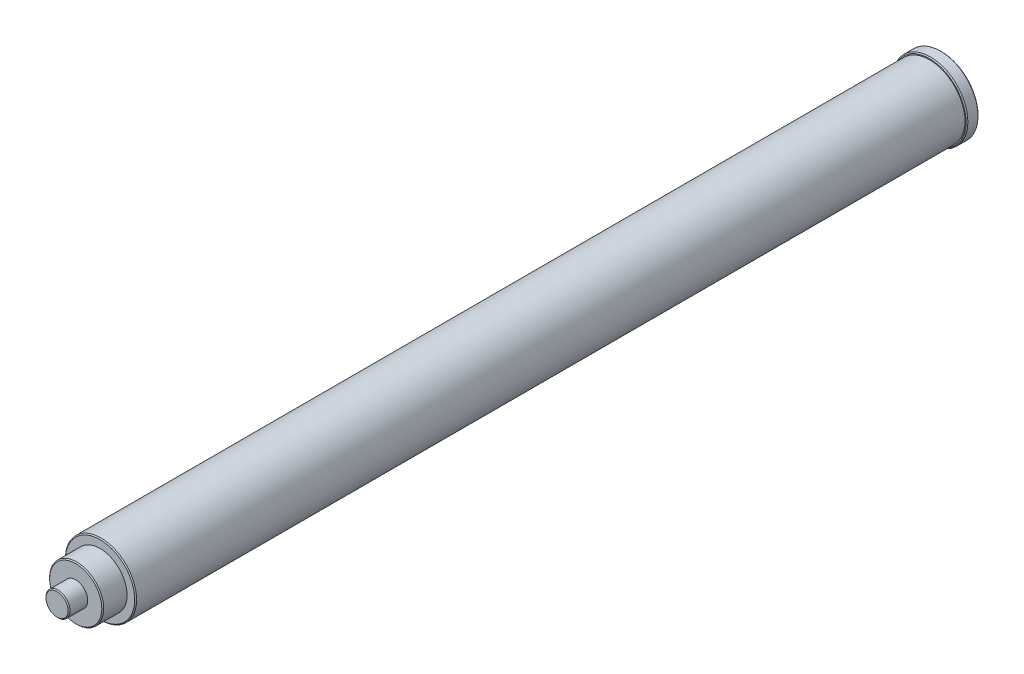
ISO-10303-21;
HEADER;
FILE_DESCRIPTION(('STEP AP214'),'2;1');
FILE_NAME('part.step','',(''),(''),'','','');
FILE_SCHEMA(('AUTOMOTIVE_DESIGN { 1 0 10303 214 1 1 1 1 }'));
ENDSEC;
DATA;
#1=APPLICATION_CONTEXT('core data for automotive mechanical design processes');
#2=APPLICATION_PROTOCOL_DEFINITION('international standard','automotive_design',2000,#1);
#3=PRODUCT_CONTEXT('',#1,'mechanical');
#4=PRODUCT('Part','Part','',(#3));
#5=PRODUCT_RELATED_PRODUCT_CATEGORY('part','',(#4));
#6=PRODUCT_DEFINITION_FORMATION('','',#4);
#7=PRODUCT_DEFINITION_CONTEXT('part definition',#1,'design');
#8=PRODUCT_DEFINITION('design','',#6,#7);
#9=PRODUCT_DEFINITION_SHAPE('','',#8);
#10=(LENGTH_UNIT() NAMED_UNIT(*) SI_UNIT(.MILLI.,.METRE.));
#11=(NAMED_UNIT(*) PLANE_ANGLE_UNIT() SI_UNIT($,.RADIAN.));
#12=(NAMED_UNIT(*) SI_UNIT($,.STERADIAN.) SOLID_ANGLE_UNIT());
#13=UNCERTAINTY_MEASURE_WITH_UNIT(LENGTH_MEASURE(1.E-05),#10,'distance_accuracy_value','');
#14=(GEOMETRIC_REPRESENTATION_CONTEXT(3) GLOBAL_UNCERTAINTY_ASSIGNED_CONTEXT((#13)) GLOBAL_UNIT_ASSIGNED_CONTEXT((#10,
#11,#12)) REPRESENTATION_CONTEXT('',''));
#15=CARTESIAN_POINT('',(0.,0.,0.));
#16=DIRECTION('',(0.,0.,1.));
#17=DIRECTION('',(1.,0.,0.));
#18=AXIS2_PLACEMENT_3D('',#15,#16,#17);
#19=CARTESIAN_POINT('',(0.,0.,12.7));
#20=DIRECTION('',(0.,0.,-1.));
#21=DIRECTION('',(-1.,0.,0.));
#22=AXIS2_PLACEMENT_3D('',#19,#20,#21);
#23=CYLINDRICAL_SURFACE('',#22,39.6875);
#24=CARTESIAN_POINT('',(0.,0.,0.999999999999987));
#25=DIRECTION('',(0.,0.,1.));
#26=DIRECTION('',(1.,0.,0.));
#27=AXIS2_PLACEMENT_3D('',#24,#25,#26);
#28=CIRCLE('',#27,39.6875);
#29=CARTESIAN_POINT('',(39.6875,0.,0.999999999999987));
#30=VERTEX_POINT('',#29);
#31=EDGE_CURVE('E76',#30,#30,#28,.T.);
#32=ORIENTED_EDGE('',*,*,#31,.T.);
#33=EDGE_LOOP('',(#32));
#34=FACE_BOUND('',#33,.T.);
#35=CARTESIAN_POINT('',(0.,0.,11.7));
#36=DIRECTION('',(0.,0.,1.));
#37=DIRECTION('',(1.,0.,0.));
#38=AXIS2_PLACEMENT_3D('',#35,#36,#37);
#39=CIRCLE('',#38,39.6875);
#40=CARTESIAN_POINT('',(39.6875,0.,11.7));
#41=VERTEX_POINT('',#40);
#42=EDGE_CURVE('E79',#41,#41,#39,.F.);
#43=ORIENTED_EDGE('',*,*,#42,.T.);
#44=EDGE_LOOP('',(#43));
#45=FACE_BOUND('',#44,.T.);
#46=ADVANCED_FACE('F43',(#34,#45),#23,.T.);
#47=CARTESIAN_POINT('',(0.,0.,12.7));
#48=DIRECTION('',(0.,0.,1.));
#49=DIRECTION('',(1.,0.,0.));
#50=AXIS2_PLACEMENT_3D('',#47,#48,#49);
#51=PLANE('',#50);
#52=CARTESIAN_POINT('',(0.,0.,12.7));
#53=DIRECTION('',(0.,0.,1.));
#54=DIRECTION('',(1.,0.,0.));
#55=AXIS2_PLACEMENT_3D('',#52,#53,#54);
#56=CIRCLE('',#55,38.6875);
#57=CARTESIAN_POINT('',(38.6875,0.,12.7));
#58=VERTEX_POINT('',#57);
#59=EDGE_CURVE('E70',#58,#58,#56,.T.);
#60=ORIENTED_EDGE('',*,*,#59,.T.);
#61=EDGE_LOOP('',(#60));
#62=FACE_BOUND('',#61,.T.);
#63=CARTESIAN_POINT('',(0.,0.,12.7));
#64=DIRECTION('',(0.,0.,1.));
#65=DIRECTION('',(1.,0.,0.));
#66=AXIS2_PLACEMENT_3D('',#63,#64,#65);
#67=CIRCLE('',#66,37.6555);
#68=CARTESIAN_POINT('',(37.6555,0.,12.7));
#69=VERTEX_POINT('',#68);
#70=EDGE_CURVE('E83',#69,#69,#67,.T.);
#71=ORIENTED_EDGE('',*,*,#70,.F.);
#72=EDGE_LOOP('',(#71));
#73=FACE_BOUND('',#72,.T.);
#74=ADVANCED_FACE('F110',(#62,#73),#51,.T.);
#75=CARTESIAN_POINT('',(0.,0.,0.));
#76=DIRECTION('',(0.,0.,1.));
#77=DIRECTION('',(1.,0.,0.));
#78=AXIS2_PLACEMENT_3D('',#75,#76,#77);
#79=PLANE('',#78);
#80=CARTESIAN_POINT('',(0.,0.,0.));
#81=DIRECTION('',(0.,0.,1.));
#82=DIRECTION('',(1.,0.,0.));
#83=AXIS2_PLACEMENT_3D('',#80,#81,#82);
#84=CIRCLE('',#83,38.6874999999999);
#85=CARTESIAN_POINT('',(38.6874999999999,0.,0.));
#86=VERTEX_POINT('',#85);
#87=EDGE_CURVE('E73',#86,#86,#84,.F.);
#88=ORIENTED_EDGE('',*,*,#87,.T.);
#89=EDGE_LOOP('',(#88));
#90=FACE_BOUND('',#89,.T.);
#91=ADVANCED_FACE('F116',(#90),#79,.F.);
#92=CARTESIAN_POINT('',(0.,0.,889.9906));
#93=DIRECTION('',(0.,0.,-1.));
#94=DIRECTION('',(-1.,0.,0.));
#95=AXIS2_PLACEMENT_3D('',#92,#93,#94);
#96=CYLINDRICAL_SURFACE('',#95,37.6555);
#97=CARTESIAN_POINT('',(0.,0.,888.9906));
#98=DIRECTION('',(0.,0.,1.));
#99=DIRECTION('',(1.,0.,0.));
#100=AXIS2_PLACEMENT_3D('',#97,#98,#99);
#101=CIRCLE('',#100,37.6555);
#102=CARTESIAN_POINT('',(37.6555,0.,888.9906));
#103=VERTEX_POINT('',#102);
#104=EDGE_CURVE('E64',#103,#103,#101,.F.);
#105=ORIENTED_EDGE('',*,*,#104,.T.);
#106=EDGE_LOOP('',(#105));
#107=FACE_BOUND('',#106,.T.);
#108=ORIENTED_EDGE('',*,*,#70,.T.);
#109=EDGE_LOOP('',(#108));
#110=FACE_BOUND('',#109,.T.);
#111=ADVANCED_FACE('F159',(#107,#110),#96,.T.);
#112=CARTESIAN_POINT('',(0.,0.,889.9906));
#113=DIRECTION('',(0.,0.,1.));
#114=DIRECTION('',(1.,0.,0.));
#115=AXIS2_PLACEMENT_3D('',#112,#113,#114);
#116=PLANE('',#115);
#117=CARTESIAN_POINT('',(0.,0.,889.9906));
#118=DIRECTION('',(0.,0.,1.));
#119=DIRECTION('',(1.,0.,0.));
#120=AXIS2_PLACEMENT_3D('',#117,#118,#119);
#121=CIRCLE('',#120,36.6555);
#122=CARTESIAN_POINT('',(36.6555,0.,889.9906));
#123=VERTEX_POINT('',#122);
#124=EDGE_CURVE('E67',#123,#123,#121,.T.);
#125=ORIENTED_EDGE('',*,*,#124,.T.);
#126=EDGE_LOOP('',(#125));
#127=FACE_BOUND('',#126,.T.);
#128=CARTESIAN_POINT('',(0.,0.,889.9906));
#129=DIRECTION('',(0.,0.,1.));
#130=DIRECTION('',(1.,0.,0.));
#131=AXIS2_PLACEMENT_3D('',#128,#129,#130);
#132=CIRCLE('',#131,28.575);
#133=CARTESIAN_POINT('',(28.575,0.,889.9906));
#134=VERTEX_POINT('',#133);
#135=EDGE_CURVE('E86',#134,#134,#132,.T.);
#136=ORIENTED_EDGE('',*,*,#135,.F.);
#137=EDGE_LOOP('',(#136));
#138=FACE_BOUND('',#137,.T.);
#139=ADVANCED_FACE('F105',(#127,#138),#116,.T.);
#140=CARTESIAN_POINT('',(0.,0.,1899.51310508962));
#141=DIRECTION('',(0.,0.,-1.));
#142=DIRECTION('',(-1.,0.,0.));
#143=AXIS2_PLACEMENT_3D('',#140,#141,#142);
#144=CYLINDRICAL_SURFACE('',#143,28.575);
#145=CARTESIAN_POINT('',(0.,0.,914.6954));
#146=DIRECTION('',(0.,0.,1.));
#147=DIRECTION('',(1.,0.,0.));
#148=AXIS2_PLACEMENT_3D('',#145,#146,#147);
#149=CIRCLE('',#148,28.575);
#150=CARTESIAN_POINT('',(28.575,0.,914.6954));
#151=VERTEX_POINT('',#150);
#152=EDGE_CURVE('E55',#151,#151,#149,.F.);
#153=ORIENTED_EDGE('',*,*,#152,.T.);
#154=EDGE_LOOP('',(#153));
#155=FACE_BOUND('',#154,.T.);
#156=ORIENTED_EDGE('',*,*,#135,.T.);
#157=EDGE_LOOP('',(#156));
#158=FACE_BOUND('',#157,.T.);
#159=ADVANCED_FACE('F96',(#155,#158),#144,.T.);
#160=CARTESIAN_POINT('',(0.,0.,915.6954));
#161=DIRECTION('',(0.,0.,1.));
#162=DIRECTION('',(1.,0.,0.));
#163=AXIS2_PLACEMENT_3D('',#160,#161,#162);
#164=PLANE('',#163);
#165=CARTESIAN_POINT('',(0.,0.,915.6954));
#166=DIRECTION('',(0.,0.,1.));
#167=DIRECTION('',(1.,0.,0.));
#168=AXIS2_PLACEMENT_3D('',#165,#166,#167);
#169=CIRCLE('',#168,27.5750000000001);
#170=CARTESIAN_POINT('',(27.5750000000001,0.,915.6954));
#171=VERTEX_POINT('',#170);
#172=EDGE_CURVE('E59',#171,#171,#169,.T.);
#173=ORIENTED_EDGE('',*,*,#172,.T.);
#174=EDGE_LOOP('',(#173));
#175=FACE_BOUND('',#174,.T.);
#176=CARTESIAN_POINT('',(0.,0.,915.6954));
#177=DIRECTION('',(0.,0.,1.));
#178=DIRECTION('',(1.,0.,0.));
#179=AXIS2_PLACEMENT_3D('',#176,#177,#178);
#180=CIRCLE('',#179,12.7);
#181=CARTESIAN_POINT('',(-12.7,0.,915.6954));
#182=VERTEX_POINT('',#181);
#183=EDGE_CURVE('E82',#182,#182,#180,.T.);
#184=ORIENTED_EDGE('',*,*,#183,.F.);
#185=EDGE_LOOP('',(#184));
#186=FACE_BOUND('',#185,.T.);
#187=ADVANCED_FACE('F94',(#175,#186),#164,.T.);
#188=CARTESIAN_POINT('',(0.,0.,1894.08342448428));
#189=DIRECTION('',(0.,0.,-1.));
#190=DIRECTION('',(-1.,0.,0.));
#191=AXIS2_PLACEMENT_3D('',#188,#189,#190);
#192=CYLINDRICAL_SURFACE('',#191,12.7);
#193=CARTESIAN_POINT('',(0.,0.,934.431200000001));
#194=DIRECTION('',(0.,0.,1.));
#195=DIRECTION('',(1.,0.,0.));
#196=AXIS2_PLACEMENT_3D('',#193,#194,#195);
#197=CIRCLE('',#196,12.7);
#198=CARTESIAN_POINT('',(-12.7,0.,934.431200000001));
#199=VERTEX_POINT('',#198);
#200=EDGE_CURVE('E11',#199,#199,#197,.F.);
#201=CARTESIAN_POINT('',(-12.7,0.,934.431200000001));
#202=CARTESIAN_POINT('',(-12.7,0.,934.236035416668));
#203=CARTESIAN_POINT('',(-12.7,0.,934.040870833334));
#204=CARTESIAN_POINT('',(-12.7,0.,933.650541666668));
#205=CARTESIAN_POINT('',(-12.7,0.,933.455377083334));
#206=CARTESIAN_POINT('',(-12.7,0.,933.065047916667));
#207=CARTESIAN_POINT('',(-12.7,0.,932.869883333334));
#208=CARTESIAN_POINT('',(-12.7,0.,932.479554166668));
#209=CARTESIAN_POINT('',(-12.7,0.,932.284389583334));
#210=CARTESIAN_POINT('',(-12.7,0.,931.894060416667));
#211=CARTESIAN_POINT('',(-12.7,0.,931.698895833334));
#212=CARTESIAN_POINT('',(-12.7,0.,931.308566666667));
#213=CARTESIAN_POINT('',(-12.7,0.,931.113402083334));
#214=CARTESIAN_POINT('',(-12.7,0.,930.723072916667));
#215=CARTESIAN_POINT('',(-12.7,0.,930.527908333334));
#216=CARTESIAN_POINT('',(-12.7,0.,930.137579166667));
#217=CARTESIAN_POINT('',(-12.7,0.,929.942414583334));
#218=CARTESIAN_POINT('',(-12.7,0.,929.552085416667));
#219=CARTESIAN_POINT('',(-12.7,0.,929.356920833334));
#220=CARTESIAN_POINT('',(-12.7,0.,928.966591666667));
#221=CARTESIAN_POINT('',(-12.7,0.,928.771427083334));
#222=CARTESIAN_POINT('',(-12.7,0.,928.381097916667));
#223=CARTESIAN_POINT('',(-12.7,0.,928.185933333334));
#224=CARTESIAN_POINT('',(-12.7,0.,927.795604166667));
#225=CARTESIAN_POINT('',(-12.7,0.,927.600439583334));
#226=CARTESIAN_POINT('',(-12.7,0.,927.210110416667));
#227=CARTESIAN_POINT('',(-12.7,0.,927.014945833334));
#228=CARTESIAN_POINT('',(-12.7,0.,926.624616666667));
#229=CARTESIAN_POINT('',(-12.7,0.,926.429452083334));
#230=CARTESIAN_POINT('',(-12.7,0.,926.039122916667));
#231=CARTESIAN_POINT('',(-12.7,0.,925.843958333334));
#232=CARTESIAN_POINT('',(-12.7,0.,925.453629166667));
#233=CARTESIAN_POINT('',(-12.7,0.,925.258464583334));
#234=CARTESIAN_POINT('',(-12.7,0.,924.868135416667));
#235=CARTESIAN_POINT('',(-12.7,0.,924.672970833334));
#236=CARTESIAN_POINT('',(-12.7,0.,924.282641666667));
#237=CARTESIAN_POINT('',(-12.7,0.,924.087477083334));
#238=CARTESIAN_POINT('',(-12.7,0.,923.697147916667));
#239=CARTESIAN_POINT('',(-12.7,0.,923.501983333334));
#240=CARTESIAN_POINT('',(-12.7,0.,923.111654166667));
#241=CARTESIAN_POINT('',(-12.7,0.,922.916489583334));
#242=CARTESIAN_POINT('',(-12.7,0.,922.526160416667));
#243=CARTESIAN_POINT('',(-12.7,0.,922.330995833334));
#244=CARTESIAN_POINT('',(-12.7,0.,921.940666666667));
#245=CARTESIAN_POINT('',(-12.7,0.,921.745502083334));
#246=CARTESIAN_POINT('',(-12.7,0.,921.355172916667));
#247=CARTESIAN_POINT('',(-12.7,0.,921.160008333334));
#248=CARTESIAN_POINT('',(-12.7,0.,920.769679166667));
#249=CARTESIAN_POINT('',(-12.7,0.,920.574514583334));
#250=CARTESIAN_POINT('',(-12.7,0.,920.184185416667));
#251=CARTESIAN_POINT('',(-12.7,0.,919.989020833334));
#252=CARTESIAN_POINT('',(-12.7,0.,919.598691666667));
#253=CARTESIAN_POINT('',(-12.7,0.,919.403527083334));
#254=CARTESIAN_POINT('',(-12.7,0.,919.013197916667));
#255=CARTESIAN_POINT('',(-12.7,0.,918.818033333334));
#256=CARTESIAN_POINT('',(-12.7,0.,918.427704166667));
#257=CARTESIAN_POINT('',(-12.7,0.,918.232539583334));
#258=CARTESIAN_POINT('',(-12.7,0.,917.842210416667));
#259=CARTESIAN_POINT('',(-12.7,0.,917.647045833333));
#260=CARTESIAN_POINT('',(-12.7,0.,917.256716666667));
#261=CARTESIAN_POINT('',(-12.7,0.,917.061552083333));
#262=CARTESIAN_POINT('',(-12.7,0.,916.671222916667));
#263=CARTESIAN_POINT('',(-12.7,0.,916.476058333333));
#264=CARTESIAN_POINT('',(-12.7,0.,916.085729166667));
#265=CARTESIAN_POINT('',(-12.7,0.,915.890564583333));
#266=CARTESIAN_POINT('',(-12.7,0.,915.6954));
#267=B_SPLINE_CURVE_WITH_KNOTS('',3,(#201,#202,#203,#204,#205,#206,#207,#208,#209,#210,#211,
#212,#213,#214,#215,#216,#217,#218,#219,#220,#221,#222,#223,#224,#225,#226,#227,#228,#229,#230,
#231,#232,#233,#234,#235,#236,#237,#238,#239,#240,#241,#242,#243,#244,#245,#246,#247,#248,#249,
#250,#251,#252,#253,#254,#255,#256,#257,#258,#259,#260,#261,#262,#263,#264,#265,#266),
.UNSPECIFIED.,.F.,.F.,(4,2,2,2,2,2,2,2,2,2,2,2,2,2,2,2,2,2,2,2,2,2,2,2,2,2,2,2,2,2,2,2,4),(0.,
0.585493750000055,1.17098750000011,1.75648125000005,2.34197500000011,2.92746875000016,
3.51296250000011,4.09845625000016,4.68395000000021,5.26944375000027,5.85493750000032,
6.44043125000027,7.02592500000032,7.61141875000038,8.19691250000032,8.78240625000037,
9.36790000000043,9.95339375000048,10.5388875000005,11.1243812500005,11.7098750000005,
12.2953687500006,12.8808625000005,13.4663562500006,14.0518500000006,14.6373437500007,
15.2228375000008,15.8083312500007,16.3938250000007,16.9793187500008,17.5648125000007,
18.1503062500008,18.7358000000009),.UNSPECIFIED.);
#268=EDGE_CURVE('BSEAM92',#199,#182,#267,.T.);
#269=ORIENTED_EDGE('',*,*,#200,.T.);
#270=ORIENTED_EDGE('',*,*,#183,.T.);
#271=ORIENTED_EDGE('',*,*,#268,.T.);
#272=ORIENTED_EDGE('',*,*,#268,.F.);
#273=EDGE_LOOP('',(#269,#271,#270,#272));
#274=FACE_BOUND('',#273,.T.);
#275=ADVANCED_FACE('F92',(#274),#192,.T.);
#276=CARTESIAN_POINT('',(0.,0.,935.4312));
#277=DIRECTION('',(0.,0.,1.));
#278=DIRECTION('',(1.,0.,0.));
#279=AXIS2_PLACEMENT_3D('',#276,#277,#278);
#280=PLANE('',#279);
#281=CARTESIAN_POINT('',(0.,0.,935.4312));
#282=DIRECTION('',(0.,0.,1.));
#283=DIRECTION('',(1.,0.,0.));
#284=AXIS2_PLACEMENT_3D('',#281,#282,#283);
#285=CIRCLE('',#284,11.7000000000009);
#286=CARTESIAN_POINT('',(11.7000000000009,0.,935.4312));
#287=VERTEX_POINT('',#286);
#288=EDGE_CURVE('E51',#287,#287,#285,.T.);
#289=ORIENTED_EDGE('',*,*,#288,.T.);
#290=EDGE_LOOP('',(#289));
#291=FACE_BOUND('',#290,.T.);
#292=ADVANCED_FACE('F103',(#291),#280,.T.);
#293=CARTESIAN_POINT('',(0.,0.,0.999999999999987));
#294=DIRECTION('',(0.,0.,1.));
#295=DIRECTION('',(1.,0.,0.));
#296=AXIS2_PLACEMENT_3D('',#293,#294,#295);
#297=CONICAL_SURFACE('',#296,39.6875,0.785398163397518);
#298=ORIENTED_EDGE('',*,*,#87,.F.);
#299=EDGE_LOOP('',(#298));
#300=FACE_BOUND('',#299,.T.);
#301=ORIENTED_EDGE('',*,*,#31,.F.);
#302=EDGE_LOOP('',(#301));
#303=FACE_BOUND('',#302,.T.);
#304=ADVANCED_FACE('F123',(#300,#303),#297,.T.);
#305=CARTESIAN_POINT('',(0.,0.,12.7));
#306=DIRECTION('',(0.,0.,-1.));
#307=DIRECTION('',(-1.,0.,0.));
#308=AXIS2_PLACEMENT_3D('',#305,#306,#307);
#309=CONICAL_SURFACE('',#308,38.6875,0.785398163397462);
#310=ORIENTED_EDGE('',*,*,#42,.F.);
#311=EDGE_LOOP('',(#310));
#312=FACE_BOUND('',#311,.T.);
#313=ORIENTED_EDGE('',*,*,#59,.F.);
#314=EDGE_LOOP('',(#313));
#315=FACE_BOUND('',#314,.T.);
#316=ADVANCED_FACE('F129',(#312,#315),#309,.T.);
#317=CARTESIAN_POINT('',(0.,0.,889.9906));
#318=DIRECTION('',(0.,0.,-1.));
#319=DIRECTION('',(-1.,0.,0.));
#320=AXIS2_PLACEMENT_3D('',#317,#318,#319);
#321=CONICAL_SURFACE('',#320,36.6555,0.785398163397469);
#322=ORIENTED_EDGE('',*,*,#104,.F.);
#323=EDGE_LOOP('',(#322));
#324=FACE_BOUND('',#323,.T.);
#325=ORIENTED_EDGE('',*,*,#124,.F.);
#326=EDGE_LOOP('',(#325));
#327=FACE_BOUND('',#326,.T.);
#328=ADVANCED_FACE('F136',(#324,#327),#321,.T.);
#329=CARTESIAN_POINT('',(0.,0.,915.6954));
#330=DIRECTION('',(0.,0.,-1.));
#331=DIRECTION('',(-1.,0.,0.));
#332=AXIS2_PLACEMENT_3D('',#329,#330,#331);
#333=CONICAL_SURFACE('',#332,27.5750000000001,0.785398163397386);
#334=ORIENTED_EDGE('',*,*,#152,.F.);
#335=EDGE_LOOP('',(#334));
#336=FACE_BOUND('',#335,.T.);
#337=ORIENTED_EDGE('',*,*,#172,.F.);
#338=EDGE_LOOP('',(#337));
#339=FACE_BOUND('',#338,.T.);
#340=ADVANCED_FACE('F142',(#336,#339),#333,.T.);
#341=CARTESIAN_POINT('',(0.,0.,935.4312));
#342=DIRECTION('',(0.,0.,-1.));
#343=DIRECTION('',(-1.,0.,0.));
#344=AXIS2_PLACEMENT_3D('',#341,#342,#343);
#345=CONICAL_SURFACE('',#344,11.7000000000009,0.785398163397427);
#346=ORIENTED_EDGE('',*,*,#200,.F.);
#347=EDGE_LOOP('',(#346));
#348=FACE_BOUND('',#347,.T.);
#349=ORIENTED_EDGE('',*,*,#288,.F.);
#350=EDGE_LOOP('',(#349));
#351=FACE_BOUND('',#350,.T.);
#352=ADVANCED_FACE('F46',(#348,#351),#345,.T.);
#353=CLOSED_SHELL('',(#46,#74,#91,#111,#139,#159,#187,#275,#292,#304,#316,#328,#340,#352));
#354=MANIFOLD_SOLID_BREP('B2',#353);
#355=ADVANCED_BREP_SHAPE_REPRESENTATION('',(#18,#354),#14);
#356=SHAPE_DEFINITION_REPRESENTATION(#9,#355);
ENDSEC;
END-ISO-10303-21;
